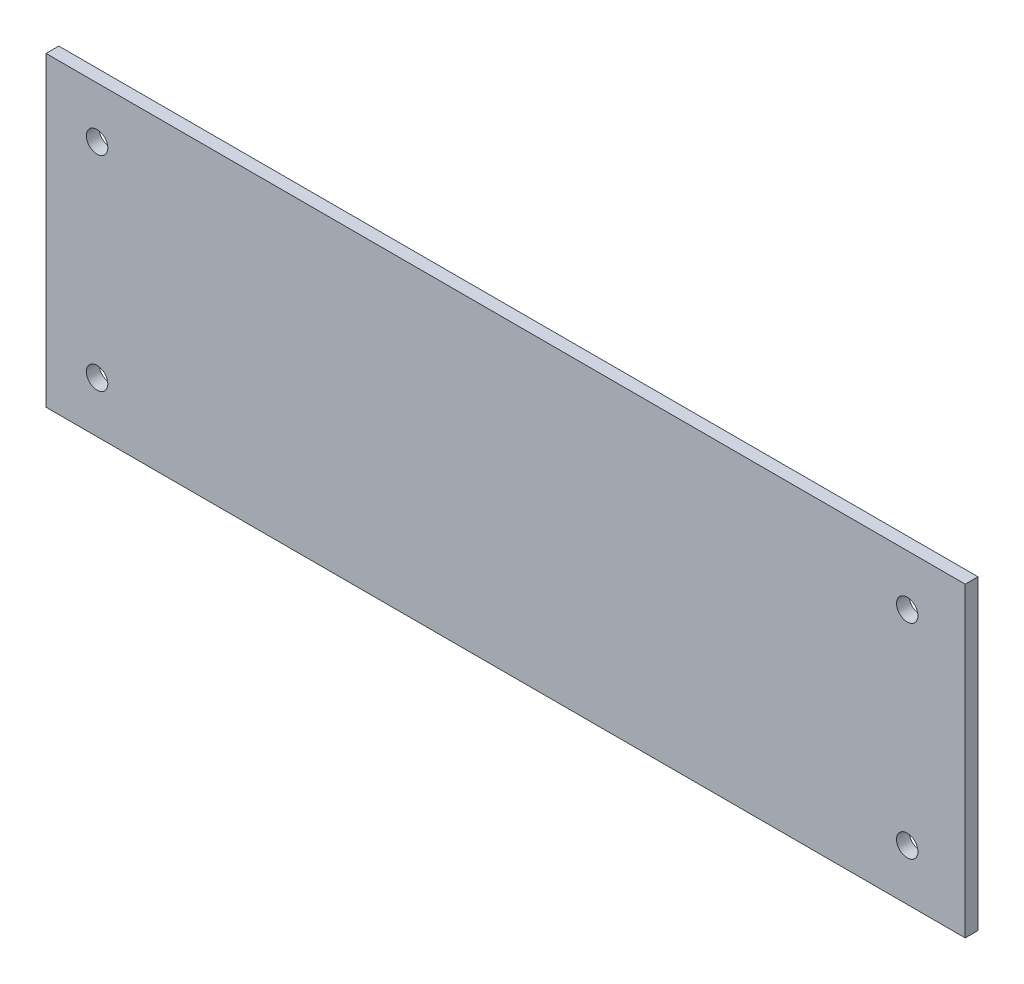
ISO-10303-21;
HEADER;
FILE_DESCRIPTION(('STEP AP214'),'2;1');
FILE_NAME('part.step','',(''),(''),'','','');
FILE_SCHEMA(('AUTOMOTIVE_DESIGN { 1 0 10303 214 1 1 1 1 }'));
ENDSEC;
DATA;
#1=APPLICATION_CONTEXT('core data for automotive mechanical design processes');
#2=APPLICATION_PROTOCOL_DEFINITION('international standard','automotive_design',2000,#1);
#3=PRODUCT_CONTEXT('',#1,'mechanical');
#4=PRODUCT('Part','Part','',(#3));
#5=PRODUCT_RELATED_PRODUCT_CATEGORY('part','',(#4));
#6=PRODUCT_DEFINITION_FORMATION('','',#4);
#7=PRODUCT_DEFINITION_CONTEXT('part definition',#1,'design');
#8=PRODUCT_DEFINITION('design','',#6,#7);
#9=PRODUCT_DEFINITION_SHAPE('','',#8);
#10=(LENGTH_UNIT() NAMED_UNIT(*) SI_UNIT(.MILLI.,.METRE.));
#11=(NAMED_UNIT(*) PLANE_ANGLE_UNIT() SI_UNIT($,.RADIAN.));
#12=(NAMED_UNIT(*) SI_UNIT($,.STERADIAN.) SOLID_ANGLE_UNIT());
#13=UNCERTAINTY_MEASURE_WITH_UNIT(LENGTH_MEASURE(1.E-05),#10,'distance_accuracy_value','');
#14=(GEOMETRIC_REPRESENTATION_CONTEXT(3) GLOBAL_UNCERTAINTY_ASSIGNED_CONTEXT((#13)) GLOBAL_UNIT_ASSIGNED_CONTEXT((#10,
#11,#12)) REPRESENTATION_CONTEXT('',''));
#15=CARTESIAN_POINT('',(0.,0.,0.));
#16=DIRECTION('',(0.,0.,1.));
#17=DIRECTION('',(1.,0.,0.));
#18=AXIS2_PLACEMENT_3D('',#15,#16,#17);
#19=CARTESIAN_POINT('',(114.3,38.1,3.175));
#20=DIRECTION('',(-1.,0.,0.));
#21=DIRECTION('',(0.,-1.,0.));
#22=AXIS2_PLACEMENT_3D('',#19,#20,#21);
#23=PLANE('',#22);
#24=DIRECTION('',(0.,1.,0.));
#25=VECTOR('',#24,1.);
#26=CARTESIAN_POINT('',(114.3,38.1,0.));
#27=LINE('',#26,#25);
#28=CARTESIAN_POINT('',(114.3,-38.1,0.));
#29=VERTEX_POINT('',#28);
#30=CARTESIAN_POINT('',(114.3,38.1,0.));
#31=VERTEX_POINT('',#30);
#32=EDGE_CURVE('E113',#29,#31,#27,.T.);
#33=ORIENTED_EDGE('',*,*,#32,.T.);
#34=DIRECTION('',(0.,0.,-1.));
#35=VECTOR('',#34,1.);
#36=CARTESIAN_POINT('',(114.3,38.1,3.175));
#37=LINE('',#36,#35);
#38=CARTESIAN_POINT('',(114.3,38.1,3.175));
#39=VERTEX_POINT('',#38);
#40=EDGE_CURVE('E11',#39,#31,#37,.T.);
#41=ORIENTED_EDGE('',*,*,#40,.F.);
#42=DIRECTION('',(0.,1.,0.));
#43=VECTOR('',#42,1.);
#44=CARTESIAN_POINT('',(114.3,38.1,3.175));
#45=LINE('',#44,#43);
#46=CARTESIAN_POINT('',(114.3,-38.1,3.175));
#47=VERTEX_POINT('',#46);
#48=EDGE_CURVE('E97',#47,#39,#45,.T.);
#49=ORIENTED_EDGE('',*,*,#48,.F.);
#50=DIRECTION('',(0.,0.,-1.));
#51=VECTOR('',#50,1.);
#52=CARTESIAN_POINT('',(114.3,-38.1,3.175));
#53=LINE('',#52,#51);
#54=EDGE_CURVE('E109',#47,#29,#53,.T.);
#55=ORIENTED_EDGE('',*,*,#54,.T.);
#56=EDGE_LOOP('',(#33,#41,#49,#55));
#57=FACE_BOUND('',#56,.T.);
#58=ADVANCED_FACE('F45',(#57),#23,.F.);
#59=CARTESIAN_POINT('',(-114.3,38.1,3.175));
#60=DIRECTION('',(0.,-1.,0.));
#61=DIRECTION('',(1.,0.,0.));
#62=AXIS2_PLACEMENT_3D('',#59,#60,#61);
#63=PLANE('',#62);
#64=DIRECTION('',(-1.,0.,0.));
#65=VECTOR('',#64,1.);
#66=CARTESIAN_POINT('',(-114.3,38.1,0.));
#67=LINE('',#66,#65);
#68=CARTESIAN_POINT('',(-114.3,38.1,0.));
#69=VERTEX_POINT('',#68);
#70=EDGE_CURVE('E102',#31,#69,#67,.T.);
#71=ORIENTED_EDGE('',*,*,#70,.T.);
#72=DIRECTION('',(0.,0.,-1.));
#73=VECTOR('',#72,1.);
#74=CARTESIAN_POINT('',(-114.3,38.1,3.175));
#75=LINE('',#74,#73);
#76=CARTESIAN_POINT('',(-114.3,38.1,3.175));
#77=VERTEX_POINT('',#76);
#78=EDGE_CURVE('E54',#77,#69,#75,.T.);
#79=ORIENTED_EDGE('',*,*,#78,.F.);
#80=DIRECTION('',(-1.,0.,0.));
#81=VECTOR('',#80,1.);
#82=CARTESIAN_POINT('',(-114.3,38.1,3.175));
#83=LINE('',#82,#81);
#84=EDGE_CURVE('E92',#39,#77,#83,.T.);
#85=ORIENTED_EDGE('',*,*,#84,.F.);
#86=ORIENTED_EDGE('',*,*,#40,.T.);
#87=EDGE_LOOP('',(#71,#79,#85,#86));
#88=FACE_BOUND('',#87,.T.);
#89=ADVANCED_FACE('F101',(#88),#63,.F.);
#90=CARTESIAN_POINT('',(-114.3,38.1,3.175));
#91=DIRECTION('',(1.,0.,0.));
#92=DIRECTION('',(0.,1.,0.));
#93=AXIS2_PLACEMENT_3D('',#90,#91,#92);
#94=PLANE('',#93);
#95=DIRECTION('',(0.,-1.,0.));
#96=VECTOR('',#95,1.);
#97=CARTESIAN_POINT('',(-114.3,38.1,0.));
#98=LINE('',#97,#96);
#99=CARTESIAN_POINT('',(-114.3,-38.1,0.));
#100=VERTEX_POINT('',#99);
#101=EDGE_CURVE('E79',#69,#100,#98,.T.);
#102=ORIENTED_EDGE('',*,*,#101,.T.);
#103=DIRECTION('',(0.,0.,-1.));
#104=VECTOR('',#103,1.);
#105=CARTESIAN_POINT('',(-114.3,-38.1,3.175));
#106=LINE('',#105,#104);
#107=CARTESIAN_POINT('',(-114.3,-38.1,3.175));
#108=VERTEX_POINT('',#107);
#109=EDGE_CURVE('E104',#108,#100,#106,.T.);
#110=ORIENTED_EDGE('',*,*,#109,.F.);
#111=DIRECTION('',(0.,-1.,0.));
#112=VECTOR('',#111,1.);
#113=CARTESIAN_POINT('',(-114.3,38.1,3.175));
#114=LINE('',#113,#112);
#115=EDGE_CURVE('E95',#77,#108,#114,.T.);
#116=ORIENTED_EDGE('',*,*,#115,.F.);
#117=ORIENTED_EDGE('',*,*,#78,.T.);
#118=EDGE_LOOP('',(#102,#110,#116,#117));
#119=FACE_BOUND('',#118,.T.);
#120=ADVANCED_FACE('F105',(#119),#94,.F.);
#121=CARTESIAN_POINT('',(-114.3,-38.1,3.175));
#122=DIRECTION('',(0.,1.,0.));
#123=DIRECTION('',(0.,0.,1.));
#124=AXIS2_PLACEMENT_3D('',#121,#122,#123);
#125=PLANE('',#124);
#126=DIRECTION('',(1.,0.,0.));
#127=VECTOR('',#126,1.);
#128=CARTESIAN_POINT('',(-114.3,-38.1,0.));
#129=LINE('',#128,#127);
#130=EDGE_CURVE('E85',#100,#29,#129,.T.);
#131=ORIENTED_EDGE('',*,*,#130,.T.);
#132=ORIENTED_EDGE('',*,*,#54,.F.);
#133=DIRECTION('',(1.,0.,0.));
#134=VECTOR('',#133,1.);
#135=CARTESIAN_POINT('',(-114.3,-38.1,3.175));
#136=LINE('',#135,#134);
#137=EDGE_CURVE('E62',#108,#47,#136,.T.);
#138=ORIENTED_EDGE('',*,*,#137,.F.);
#139=ORIENTED_EDGE('',*,*,#109,.T.);
#140=EDGE_LOOP('',(#131,#132,#138,#139));
#141=FACE_BOUND('',#140,.T.);
#142=ADVANCED_FACE('F127',(#141),#125,.F.);
#143=CARTESIAN_POINT('',(0.,0.,3.175));
#144=DIRECTION('',(0.,0.,1.));
#145=DIRECTION('',(1.,0.,0.));
#146=AXIS2_PLACEMENT_3D('',#143,#144,#145);
#147=PLANE('',#146);
#148=CARTESIAN_POINT('',(99.8726415839793,25.4,3.175));
#149=DIRECTION('',(0.,0.,1.));
#150=DIRECTION('',(-1.,0.,0.));
#151=AXIS2_PLACEMENT_3D('',#148,#149,#150);
#152=CIRCLE('',#151,2.667);
#153=CARTESIAN_POINT('',(97.2056415839793,25.4,3.175));
#154=VERTEX_POINT('',#153);
#155=EDGE_CURVE('E146',#154,#154,#152,.T.);
#156=ORIENTED_EDGE('',*,*,#155,.F.);
#157=EDGE_LOOP('',(#156));
#158=FACE_BOUND('',#157,.T.);
#159=CARTESIAN_POINT('',(99.8726415839793,-25.4,3.175));
#160=DIRECTION('',(0.,0.,1.));
#161=DIRECTION('',(1.,0.,0.));
#162=AXIS2_PLACEMENT_3D('',#159,#160,#161);
#163=CIRCLE('',#162,2.667);
#164=CARTESIAN_POINT('',(102.539641583979,-25.4,3.175));
#165=VERTEX_POINT('',#164);
#166=EDGE_CURVE('E154',#165,#165,#163,.T.);
#167=ORIENTED_EDGE('',*,*,#166,.F.);
#168=EDGE_LOOP('',(#167));
#169=FACE_BOUND('',#168,.T.);
#170=CARTESIAN_POINT('',(-101.6,-25.4,3.175));
#171=DIRECTION('',(0.,0.,1.));
#172=DIRECTION('',(-1.,0.,0.));
#173=AXIS2_PLACEMENT_3D('',#170,#171,#172);
#174=CIRCLE('',#173,2.667);
#175=CARTESIAN_POINT('',(-104.267,-25.4,3.175));
#176=VERTEX_POINT('',#175);
#177=EDGE_CURVE('E138',#176,#176,#174,.T.);
#178=ORIENTED_EDGE('',*,*,#177,.F.);
#179=EDGE_LOOP('',(#178));
#180=FACE_BOUND('',#179,.T.);
#181=CARTESIAN_POINT('',(-101.6,25.4,3.175));
#182=DIRECTION('',(0.,0.,1.));
#183=DIRECTION('',(1.,0.,0.));
#184=AXIS2_PLACEMENT_3D('',#181,#182,#183);
#185=CIRCLE('',#184,2.667);
#186=CARTESIAN_POINT('',(-98.933,25.4,3.175));
#187=VERTEX_POINT('',#186);
#188=EDGE_CURVE('E134',#187,#187,#185,.T.);
#189=ORIENTED_EDGE('',*,*,#188,.F.);
#190=EDGE_LOOP('',(#189));
#191=FACE_BOUND('',#190,.T.);
#192=ORIENTED_EDGE('',*,*,#48,.T.);
#193=ORIENTED_EDGE('',*,*,#84,.T.);
#194=ORIENTED_EDGE('',*,*,#115,.T.);
#195=ORIENTED_EDGE('',*,*,#137,.T.);
#196=EDGE_LOOP('',(#192,#193,#194,#195));
#197=FACE_BOUND('',#196,.T.);
#198=ADVANCED_FACE('F93',(#158,#169,#180,#191,#197),#147,.T.);
#199=CARTESIAN_POINT('',(0.,0.,0.));
#200=DIRECTION('',(0.,0.,1.));
#201=DIRECTION('',(1.,0.,0.));
#202=AXIS2_PLACEMENT_3D('',#199,#200,#201);
#203=PLANE('',#202);
#204=CARTESIAN_POINT('',(99.8726415839793,25.4,0.));
#205=DIRECTION('',(0.,0.,1.));
#206=DIRECTION('',(-1.,0.,0.));
#207=AXIS2_PLACEMENT_3D('',#204,#205,#206);
#208=CIRCLE('',#207,2.667);
#209=CARTESIAN_POINT('',(97.2056415839793,25.4,0.));
#210=VERTEX_POINT('',#209);
#211=EDGE_CURVE('E142',#210,#210,#208,.T.);
#212=ORIENTED_EDGE('',*,*,#211,.T.);
#213=EDGE_LOOP('',(#212));
#214=FACE_BOUND('',#213,.T.);
#215=CARTESIAN_POINT('',(99.8726415839793,-25.4,0.));
#216=DIRECTION('',(0.,0.,1.));
#217=DIRECTION('',(1.,0.,0.));
#218=AXIS2_PLACEMENT_3D('',#215,#216,#217);
#219=CIRCLE('',#218,2.667);
#220=CARTESIAN_POINT('',(102.539641583979,-25.4,0.));
#221=VERTEX_POINT('',#220);
#222=EDGE_CURVE('E150',#221,#221,#219,.T.);
#223=ORIENTED_EDGE('',*,*,#222,.T.);
#224=EDGE_LOOP('',(#223));
#225=FACE_BOUND('',#224,.T.);
#226=CARTESIAN_POINT('',(-101.6,-25.4,0.));
#227=DIRECTION('',(0.,0.,1.));
#228=DIRECTION('',(-1.,0.,0.));
#229=AXIS2_PLACEMENT_3D('',#226,#227,#228);
#230=CIRCLE('',#229,2.667);
#231=CARTESIAN_POINT('',(-104.267,-25.4,0.));
#232=VERTEX_POINT('',#231);
#233=EDGE_CURVE('E158',#232,#232,#230,.T.);
#234=ORIENTED_EDGE('',*,*,#233,.T.);
#235=EDGE_LOOP('',(#234));
#236=FACE_BOUND('',#235,.T.);
#237=CARTESIAN_POINT('',(-101.6,25.4,0.));
#238=DIRECTION('',(0.,0.,1.));
#239=DIRECTION('',(1.,0.,0.));
#240=AXIS2_PLACEMENT_3D('',#237,#238,#239);
#241=CIRCLE('',#240,2.667);
#242=CARTESIAN_POINT('',(-98.933,25.4,0.));
#243=VERTEX_POINT('',#242);
#244=EDGE_CURVE('E117',#243,#243,#241,.T.);
#245=ORIENTED_EDGE('',*,*,#244,.T.);
#246=EDGE_LOOP('',(#245));
#247=FACE_BOUND('',#246,.T.);
#248=ORIENTED_EDGE('',*,*,#32,.F.);
#249=ORIENTED_EDGE('',*,*,#130,.F.);
#250=ORIENTED_EDGE('',*,*,#101,.F.);
#251=ORIENTED_EDGE('',*,*,#70,.F.);
#252=EDGE_LOOP('',(#248,#249,#250,#251));
#253=FACE_BOUND('',#252,.T.);
#254=ADVANCED_FACE('F130',(#214,#225,#236,#247,#253),#203,.F.);
#255=CARTESIAN_POINT('',(-101.6,25.4,0.));
#256=DIRECTION('',(0.,0.,1.));
#257=DIRECTION('',(1.,0.,0.));
#258=AXIS2_PLACEMENT_3D('',#255,#256,#257);
#259=CYLINDRICAL_SURFACE('',#258,2.667);
#260=ORIENTED_EDGE('',*,*,#244,.F.);
#261=EDGE_LOOP('',(#260));
#262=FACE_BOUND('',#261,.T.);
#263=ORIENTED_EDGE('',*,*,#188,.T.);
#264=EDGE_LOOP('',(#263));
#265=FACE_BOUND('',#264,.T.);
#266=ADVANCED_FACE('F174',(#262,#265),#259,.F.);
#267=CARTESIAN_POINT('',(-101.6,-25.4,0.));
#268=DIRECTION('',(0.,0.,1.));
#269=DIRECTION('',(1.,0.,0.));
#270=AXIS2_PLACEMENT_3D('',#267,#268,#269);
#271=CYLINDRICAL_SURFACE('',#270,2.667);
#272=ORIENTED_EDGE('',*,*,#233,.F.);
#273=EDGE_LOOP('',(#272));
#274=FACE_BOUND('',#273,.T.);
#275=ORIENTED_EDGE('',*,*,#177,.T.);
#276=EDGE_LOOP('',(#275));
#277=FACE_BOUND('',#276,.T.);
#278=ADVANCED_FACE('F166',(#274,#277),#271,.F.);
#279=CARTESIAN_POINT('',(99.8726415839793,-25.4,0.));
#280=DIRECTION('',(0.,0.,1.));
#281=DIRECTION('',(1.,0.,0.));
#282=AXIS2_PLACEMENT_3D('',#279,#280,#281);
#283=CYLINDRICAL_SURFACE('',#282,2.667);
#284=ORIENTED_EDGE('',*,*,#222,.F.);
#285=EDGE_LOOP('',(#284));
#286=FACE_BOUND('',#285,.T.);
#287=ORIENTED_EDGE('',*,*,#166,.T.);
#288=EDGE_LOOP('',(#287));
#289=FACE_BOUND('',#288,.T.);
#290=ADVANCED_FACE('F182',(#286,#289),#283,.F.);
#291=CARTESIAN_POINT('',(99.8726415839793,25.4,0.));
#292=DIRECTION('',(0.,0.,1.));
#293=DIRECTION('',(1.,0.,0.));
#294=AXIS2_PLACEMENT_3D('',#291,#292,#293);
#295=CYLINDRICAL_SURFACE('',#294,2.667);
#296=ORIENTED_EDGE('',*,*,#211,.F.);
#297=EDGE_LOOP('',(#296));
#298=FACE_BOUND('',#297,.T.);
#299=ORIENTED_EDGE('',*,*,#155,.T.);
#300=EDGE_LOOP('',(#299));
#301=FACE_BOUND('',#300,.T.);
#302=ADVANCED_FACE('F233',(#298,#301),#295,.F.);
#303=CLOSED_SHELL('',(#58,#89,#120,#142,#198,#254,#266,#278,#290,#302));
#304=MANIFOLD_SOLID_BREP('B2',#303);
#305=ADVANCED_BREP_SHAPE_REPRESENTATION('',(#18,#304),#14);
#306=SHAPE_DEFINITION_REPRESENTATION(#9,#305);
ENDSEC;
END-ISO-10303-21;
